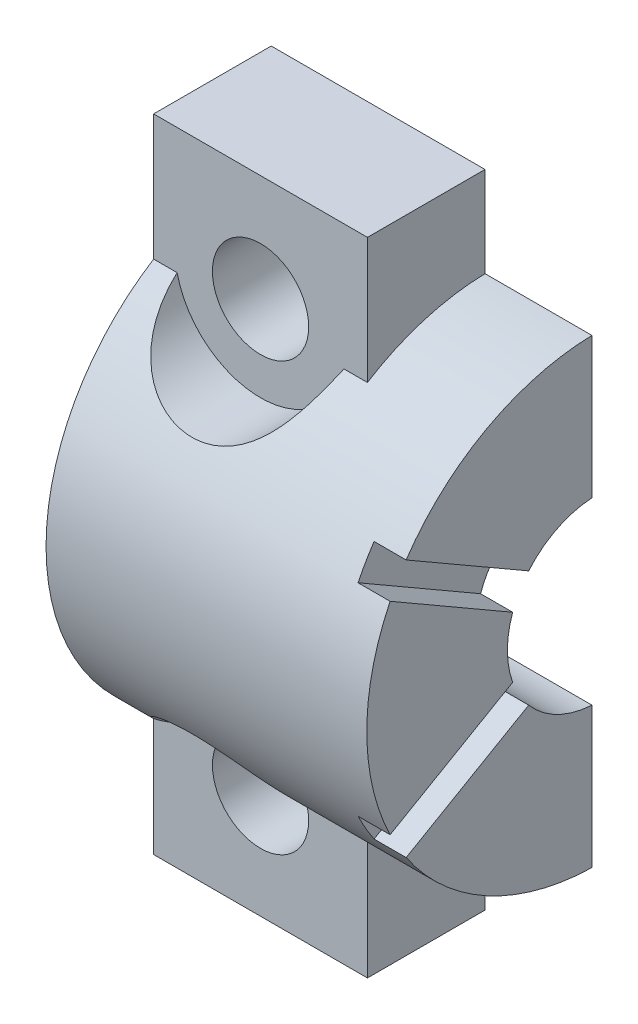
ISO-10303-21;
HEADER;
FILE_DESCRIPTION(('STEP AP214'),'2;1');
FILE_NAME('part.step','',(''),(''),'','','');
FILE_SCHEMA(('AUTOMOTIVE_DESIGN { 1 0 10303 214 1 1 1 1 }'));
ENDSEC;
DATA;
#1=APPLICATION_CONTEXT('core data for automotive mechanical design processes');
#2=APPLICATION_PROTOCOL_DEFINITION('international standard','automotive_design',2000,#1);
#3=PRODUCT_CONTEXT('',#1,'mechanical');
#4=PRODUCT('Part','Part','',(#3));
#5=PRODUCT_RELATED_PRODUCT_CATEGORY('part','',(#4));
#6=PRODUCT_DEFINITION_FORMATION('','',#4);
#7=PRODUCT_DEFINITION_CONTEXT('part definition',#1,'design');
#8=PRODUCT_DEFINITION('design','',#6,#7);
#9=PRODUCT_DEFINITION_SHAPE('','',#8);
#10=(LENGTH_UNIT() NAMED_UNIT(*) SI_UNIT(.MILLI.,.METRE.));
#11=(NAMED_UNIT(*) PLANE_ANGLE_UNIT() SI_UNIT($,.RADIAN.));
#12=(NAMED_UNIT(*) SI_UNIT($,.STERADIAN.) SOLID_ANGLE_UNIT());
#13=UNCERTAINTY_MEASURE_WITH_UNIT(LENGTH_MEASURE(1.E-05),#10,'distance_accuracy_value','');
#14=(GEOMETRIC_REPRESENTATION_CONTEXT(3) GLOBAL_UNCERTAINTY_ASSIGNED_CONTEXT((#13)) GLOBAL_UNIT_ASSIGNED_CONTEXT((#10,
#11,#12)) REPRESENTATION_CONTEXT('',''));
#15=CARTESIAN_POINT('',(0.,0.,0.));
#16=DIRECTION('',(0.,0.,1.));
#17=DIRECTION('',(1.,0.,0.));
#18=AXIS2_PLACEMENT_3D('',#15,#16,#17);
#19=CARTESIAN_POINT('',(0.,0.,0.));
#20=DIRECTION('',(0.,0.,-1.));
#21=DIRECTION('',(-1.,0.,0.));
#22=AXIS2_PLACEMENT_3D('',#19,#20,#21);
#23=PLANE('',#22);
#24=DIRECTION('',(1.,0.,0.));
#25=VECTOR('',#24,1.);
#26=CARTESIAN_POINT('',(-5.,-15.,0.));
#27=LINE('',#26,#25);
#28=CARTESIAN_POINT('',(-5.,-15.,0.));
#29=VERTEX_POINT('',#28);
#30=CARTESIAN_POINT('',(5.,-15.,0.));
#31=VERTEX_POINT('',#30);
#32=EDGE_CURVE('E233',#29,#31,#27,.T.);
#33=ORIENTED_EDGE('',*,*,#32,.F.);
#34=DIRECTION('',(0.,-1.,0.));
#35=VECTOR('',#34,1.);
#36=CARTESIAN_POINT('',(-5.,-15.,0.));
#37=LINE('',#36,#35);
#38=CARTESIAN_POINT('',(-5.,-4.19756179227894,0.));
#39=VERTEX_POINT('',#38);
#40=EDGE_CURVE('E230',#39,#29,#37,.T.);
#41=ORIENTED_EDGE('',*,*,#40,.F.);
#42=DIRECTION('',(1.,0.,0.));
#43=VECTOR('',#42,1.);
#44=CARTESIAN_POINT('',(-5.,-4.19756179227894,0.));
#45=LINE('',#44,#43);
#46=CARTESIAN_POINT('',(10.,-4.19756179227894,0.));
#47=VERTEX_POINT('',#46);
#48=EDGE_CURVE('E246',#47,#39,#45,.F.);
#49=ORIENTED_EDGE('',*,*,#48,.F.);
#50=DIRECTION('',(0.,1.,0.));
#51=VECTOR('',#50,1.);
#52=CARTESIAN_POINT('',(10.,0.,0.));
#53=LINE('',#52,#51);
#54=CARTESIAN_POINT('',(10.,-10.778360831734,0.));
#55=VERTEX_POINT('',#54);
#56=EDGE_CURVE('E438',#55,#47,#53,.T.);
#57=ORIENTED_EDGE('',*,*,#56,.F.);
#58=DIRECTION('',(1.,0.,0.));
#59=VECTOR('',#58,1.);
#60=CARTESIAN_POINT('',(-28.9916585756488,-10.778360831734,0.));
#61=LINE('',#60,#59);
#62=CARTESIAN_POINT('',(5.,-10.778360831734,0.));
#63=VERTEX_POINT('',#62);
#64=EDGE_CURVE('E362',#63,#55,#61,.T.);
#65=ORIENTED_EDGE('',*,*,#64,.F.);
#66=DIRECTION('',(0.,1.,0.));
#67=VECTOR('',#66,1.);
#68=CARTESIAN_POINT('',(5.,-15.,0.));
#69=LINE('',#68,#67);
#70=EDGE_CURVE('E226',#31,#63,#69,.T.);
#71=ORIENTED_EDGE('',*,*,#70,.F.);
#72=EDGE_LOOP('',(#33,#41,#49,#57,#65,#71));
#73=FACE_BOUND('',#72,.T.);
#74=CARTESIAN_POINT('',(0.,-10.,0.));
#75=DIRECTION('',(0.,0.,1.));
#76=DIRECTION('',(1.,0.,0.));
#77=AXIS2_PLACEMENT_3D('',#74,#75,#76);
#78=CIRCLE('',#77,2.25);
#79=CARTESIAN_POINT('',(2.25,-10.,0.));
#80=VERTEX_POINT('',#79);
#81=EDGE_CURVE('E398',#80,#80,#78,.T.);
#82=ORIENTED_EDGE('',*,*,#81,.T.);
#83=EDGE_LOOP('',(#82));
#84=FACE_BOUND('',#83,.T.);
#85=ADVANCED_FACE('F41',(#73,#84),#23,.T.);
#86=CARTESIAN_POINT('',(-5.,0.,-0.25));
#87=DIRECTION('',(1.,0.,0.));
#88=DIRECTION('',(0.,0.,-1.));
#89=AXIS2_PLACEMENT_3D('',#86,#87,#88);
#90=CYLINDRICAL_SURFACE('',#89,4.205);
#91=DIRECTION('',(1.,0.,0.));
#92=VECTOR('',#91,1.);
#93=CARTESIAN_POINT('',(-5.,2.71830643920744,2.95824486324897));
#94=LINE('',#93,#92);
#95=CARTESIAN_POINT('',(8.5,2.71830643920744,2.95824486324897));
#96=VERTEX_POINT('',#95);
#97=CARTESIAN_POINT('',(10.,2.71830643920744,2.95824486324897));
#98=VERTEX_POINT('',#97);
#99=EDGE_CURVE('E412',#96,#98,#94,.T.);
#100=ORIENTED_EDGE('',*,*,#99,.F.);
#101=CARTESIAN_POINT('',(8.5,0.,-0.25));
#102=DIRECTION('',(-1.,0.,0.));
#103=DIRECTION('',(0.,0.,1.));
#104=AXIS2_PLACEMENT_3D('',#101,#102,#103);
#105=CIRCLE('',#104,4.205);
#106=CARTESIAN_POINT('',(8.5,1.41926833353077,3.70824486324896));
#107=VERTEX_POINT('',#106);
#108=EDGE_CURVE('E414',#96,#107,#105,.F.);
#109=ORIENTED_EDGE('',*,*,#108,.T.);
#110=DIRECTION('',(1.,0.,0.));
#111=VECTOR('',#110,1.);
#112=CARTESIAN_POINT('',(-5.,1.41926833353077,3.70824486324896));
#113=LINE('',#112,#111);
#114=CARTESIAN_POINT('',(10.,1.41926833353077,3.70824486324896));
#115=VERTEX_POINT('',#114);
#116=EDGE_CURVE('E407',#107,#115,#113,.T.);
#117=ORIENTED_EDGE('',*,*,#116,.T.);
#118=CARTESIAN_POINT('',(10.,0.,-0.25));
#119=DIRECTION('',(1.,0.,0.));
#120=DIRECTION('',(0.,0.,-1.));
#121=AXIS2_PLACEMENT_3D('',#118,#119,#120);
#122=CIRCLE('',#121,4.205);
#123=CARTESIAN_POINT('',(10.,-1.4192683335308,3.70824486324895));
#124=VERTEX_POINT('',#123);
#125=EDGE_CURVE('E369',#124,#115,#122,.F.);
#126=ORIENTED_EDGE('',*,*,#125,.F.);
#127=DIRECTION('',(1.,0.,0.));
#128=VECTOR('',#127,1.);
#129=CARTESIAN_POINT('',(-5.,-1.4192683335308,3.70824486324895));
#130=LINE('',#129,#128);
#131=CARTESIAN_POINT('',(8.5,-1.4192683335308,3.70824486324895));
#132=VERTEX_POINT('',#131);
#133=EDGE_CURVE('E429',#132,#124,#130,.T.);
#134=ORIENTED_EDGE('',*,*,#133,.F.);
#135=CARTESIAN_POINT('',(8.5,0.,-0.25));
#136=DIRECTION('',(-1.,0.,0.));
#137=DIRECTION('',(0.,0.,1.));
#138=AXIS2_PLACEMENT_3D('',#135,#136,#137);
#139=CIRCLE('',#138,4.205);
#140=CARTESIAN_POINT('',(8.5,-2.71830643920746,2.95824486324895));
#141=VERTEX_POINT('',#140);
#142=EDGE_CURVE('E431',#132,#141,#139,.F.);
#143=ORIENTED_EDGE('',*,*,#142,.T.);
#144=DIRECTION('',(1.,0.,0.));
#145=VECTOR('',#144,1.);
#146=CARTESIAN_POINT('',(-5.,-2.71830643920746,2.95824486324895));
#147=LINE('',#146,#145);
#148=CARTESIAN_POINT('',(10.,-2.71830643920746,2.95824486324895));
#149=VERTEX_POINT('',#148);
#150=EDGE_CURVE('E423',#141,#149,#147,.T.);
#151=ORIENTED_EDGE('',*,*,#150,.T.);
#152=EDGE_CURVE('E363',#47,#149,#122,.F.);
#153=ORIENTED_EDGE('',*,*,#152,.F.);
#154=ORIENTED_EDGE('',*,*,#48,.T.);
#155=CARTESIAN_POINT('',(-5.,0.,-0.25));
#156=DIRECTION('',(1.,0.,0.));
#157=DIRECTION('',(0.,0.,-1.));
#158=AXIS2_PLACEMENT_3D('',#155,#156,#157);
#159=CIRCLE('',#158,4.205);
#160=CARTESIAN_POINT('',(-5.,4.19756179227894,0.));
#161=VERTEX_POINT('',#160);
#162=EDGE_CURVE('E207',#161,#39,#159,.T.);
#163=ORIENTED_EDGE('',*,*,#162,.F.);
#164=DIRECTION('',(1.,0.,0.));
#165=VECTOR('',#164,1.);
#166=CARTESIAN_POINT('',(-5.,4.19756179227894,0.));
#167=LINE('',#166,#165);
#168=CARTESIAN_POINT('',(10.,4.19756179227894,0.));
#169=VERTEX_POINT('',#168);
#170=EDGE_CURVE('E248',#161,#169,#167,.T.);
#171=ORIENTED_EDGE('',*,*,#170,.T.);
#172=EDGE_CURVE('E371',#98,#169,#122,.F.);
#173=ORIENTED_EDGE('',*,*,#172,.F.);
#174=EDGE_LOOP('',(#100,#109,#117,#126,#134,#143,#151,#153,#154,#163,#171,#173));
#175=FACE_BOUND('',#174,.T.);
#176=ADVANCED_FACE('F326',(#175),#90,.F.);
#177=CARTESIAN_POINT('',(-28.9916585756488,0.,-0.25));
#178=DIRECTION('',(1.,0.,0.));
#179=DIRECTION('',(0.,0.,-1.));
#180=AXIS2_PLACEMENT_3D('',#177,#178,#179);
#181=CYLINDRICAL_SURFACE('',#180,10.7812597695751);
#182=CARTESIAN_POINT('',(-3.90198294588478,9.11992665645167,5.5));
#183=CARTESIAN_POINT('',(-3.88915478812282,9.06307341331074,5.59017449314433));
#184=CARTESIAN_POINT('',(-3.87475338101255,9.00498945363241,5.67933204857714));
#185=CARTESIAN_POINT('',(-3.84238518660202,8.88651052586628,5.85547070704793));
#186=CARTESIAN_POINT('',(-3.82441741977101,8.82611492655388,5.94245120473117));
#187=CARTESIAN_POINT('',(-3.76425168775188,8.64082303685709,6.2011117562662));
#188=CARTESIAN_POINT('',(-3.71596882233741,8.51266967606388,6.36916807038626));
#189=CARTESIAN_POINT('',(-3.62123618638365,8.29856779966826,6.63380695928576));
#190=CARTESIAN_POINT('',(-3.58062863477395,8.21440916016524,6.73396684135775));
#191=CARTESIAN_POINT('',(-3.49076928787825,8.0445573697885,6.9289515116471));
#192=CARTESIAN_POINT('',(-3.44152050299503,7.95886476261855,7.02377814270094));
#193=CARTESIAN_POINT('',(-3.33375129476198,7.78723207145548,7.2072328018618));
#194=CARTESIAN_POINT('',(-3.27525605993475,7.70129326520109,7.29587675326883));
#195=CARTESIAN_POINT('',(-3.14827958580289,7.5302489322511,7.46657295738462));
#196=CARTESIAN_POINT('',(-3.07980106099345,7.44514318573468,7.54862699254122));
#197=CARTESIAN_POINT('',(-2.94732453469085,7.29422344009132,7.68966549725386));
#198=CARTESIAN_POINT('',(-2.88520966387097,7.22798125932153,7.74996449196039));
#199=CARTESIAN_POINT('',(-2.75428717301305,7.09786017493243,7.86563404113933));
#200=CARTESIAN_POINT('',(-2.68548093694552,7.03398078637525,7.92100561022989));
#201=CARTESIAN_POINT('',(-2.54118288423732,6.90945374280165,8.02657422427533));
#202=CARTESIAN_POINT('',(-2.46568717733347,6.84880800158501,8.07676822100602));
#203=CARTESIAN_POINT('',(-2.30829407235652,6.73176032329351,8.17167686656561));
#204=CARTESIAN_POINT('',(-2.22639976777282,6.67535636104273,8.21639413667122));
#205=CARTESIAN_POINT('',(-2.05602027394492,6.5673602378349,8.30044182578099));
#206=CARTESIAN_POINT('',(-1.96749717562868,6.51580026975539,8.3397369209054));
#207=CARTESIAN_POINT('',(-1.7848955994218,6.41882299116927,8.41244467959653));
#208=CARTESIAN_POINT('',(-1.69081961748062,6.37340295059934,8.44585995957708));
#209=CARTESIAN_POINT('',(-1.49776790245325,6.28950568921399,8.50673278923468));
#210=CARTESIAN_POINT('',(-1.39879225546479,6.25102834645548,8.53419044355451));
#211=CARTESIAN_POINT('',(-1.19676098928304,6.18173283384868,8.58309363519935));
#212=CARTESIAN_POINT('',(-1.0937057903473,6.15091387743508,8.60453978997284));
#213=CARTESIAN_POINT('',(-0.895201804258613,6.10025595472564,8.63950422683373));
#214=CARTESIAN_POINT('',(-0.800060368921739,6.07961386001304,8.65361091170681));
#215=CARTESIAN_POINT('',(-0.607910469051083,6.04525959374726,8.67697215810425));
#216=CARTESIAN_POINT('',(-0.510901400363722,6.03154970513957,8.68622512121649));
#217=CARTESIAN_POINT('',(-0.315865168058899,6.01128641288921,8.69986856004321));
#218=CARTESIAN_POINT('',(-0.217838716243804,6.00472830687283,8.70426223082145));
#219=CARTESIAN_POINT('',(-0.0214344487847485,5.99885072164389,8.70820101088172));
#220=CARTESIAN_POINT('',(0.0769434813456644,5.99953386725275,8.70774436201137));
#221=CARTESIAN_POINT('',(0.268777701823314,6.00793858304255,8.70210919510973));
#222=CARTESIAN_POINT('',(0.362254626419306,6.01533913777062,8.69714603336443));
#223=CARTESIAN_POINT('',(0.548156712133022,6.03663272970387,8.68279308799052));
#224=CARTESIAN_POINT('',(0.640581492109701,6.05052804750373,8.67340174942562));
#225=CARTESIAN_POINT('',(0.823646988288896,6.08461118070082,8.65019622599559));
#226=CARTESIAN_POINT('',(0.914288614662407,6.10479569240018,8.63638436311759));
#227=CARTESIAN_POINT('',(1.09325079362337,6.15118819666196,8.60433455659975));
#228=CARTESIAN_POINT('',(1.1815704737516,6.17739841830172,8.58609497488387));
#229=CARTESIAN_POINT('',(1.35558993471274,6.23558522896432,8.54512976564765));
#230=CARTESIAN_POINT('',(1.44127926240171,6.26758202605459,8.5223883896145));
#231=CARTESIAN_POINT('',(1.60918932266124,6.33683541249837,8.47249400247579));
#232=CARTESIAN_POINT('',(1.69140879495847,6.37409389193305,8.44533940553908));
#233=CARTESIAN_POINT('',(1.93208490068475,6.49301062140546,8.35732772644335));
#234=CARTESIAN_POINT('',(2.08470894720048,6.58186126057911,8.28988779867628));
#235=CARTESIAN_POINT('',(2.37839232290267,6.7788007973665,8.13450262504058));
#236=CARTESIAN_POINT('',(2.51849128606859,6.88762970122812,8.04570042074368));
#237=CARTESIAN_POINT('',(2.77664459835844,7.11557649122033,7.85102075401282));
#238=CARTESIAN_POINT('',(2.89469725485466,7.2346951663326,7.74514198166998));
#239=CARTESIAN_POINT('',(3.07600213966994,7.44053429163797,7.55303601860933));
#240=CARTESIAN_POINT('',(3.14496192380018,7.52599765984082,7.47072861187534));
#241=CARTESIAN_POINT('',(3.27282969243874,7.69781654310284,7.29942953990437));
#242=CARTESIAN_POINT('',(3.33173404584337,7.78417236854815,7.21043547669369));
#243=CARTESIAN_POINT('',(3.44023534488381,7.95666918097199,7.02619087907062));
#244=CARTESIAN_POINT('',(3.48980378200092,8.0428087419693,6.93092234293173));
#245=CARTESIAN_POINT('',(3.58021157641135,8.21354559702769,6.73499423523558));
#246=CARTESIAN_POINT('',(3.62104782597902,8.29814233224245,6.63433276025405));
#247=CARTESIAN_POINT('',(3.71597813533576,8.51269034773149,6.36914266812123));
#248=CARTESIAN_POINT('',(3.76426663279042,8.64086258427933,6.2010599135221));
#249=CARTESIAN_POINT('',(3.8244316498195,8.82616196693406,5.94238386165377));
#250=CARTESIAN_POINT('',(3.84239580416912,8.88654775881997,5.85541622031855));
#251=CARTESIAN_POINT('',(3.87475790106451,9.00500762534525,5.6793041677308));
#252=CARTESIAN_POINT('',(3.88915683035567,9.06308233587832,5.59016036629359));
#253=CARTESIAN_POINT('',(3.90198294588478,9.11992665645167,5.5));
#254=B_SPLINE_CURVE_WITH_KNOTS('',3,(#182,#183,#184,#185,#186,#187,#188,#189,#190,#191,#192,
#193,#194,#195,#196,#197,#198,#199,#200,#201,#202,#203,#204,#205,#206,#207,#208,#209,#210,#211,
#212,#213,#214,#215,#216,#217,#218,#219,#220,#221,#222,#223,#224,#225,#226,#227,#228,#229,#230,
#231,#232,#233,#234,#235,#236,#237,#238,#239,#240,#241,#242,#243,#244,#245,#246,#247,#248,#249,
#250,#251,#252,#253),.UNSPECIFIED.,.F.,.F.,(4,2,2,2,2,2,2,2,2,2,2,2,2,2,2,2,2,2,2,2,2,2,2,2,2,2,
2,2,2,2,2,2,2,2,2,4),(0.,0.322050069679456,0.644188715829641,1.29324304907911,1.70386677735999,
2.11434773697905,2.52372917554993,2.93299950861411,3.25970325439259,3.58633957139136,
3.91316710642086,4.23983759848184,4.56854479693666,4.89710535455478,5.22566014070001,
5.55418116820488,5.84892491101082,6.14376565704302,6.4384124250211,6.7331660007204,
7.01453515278113,7.29600318013861,7.57732360160232,7.85874825923106,8.14117539274917,
8.4237042379356,8.98828156874892,9.58109976110972,10.1739634489976,10.5851602317276,
10.996505188531,11.4090865711744,11.8218145452148,12.470968726146,12.7930577330697,
13.1150574956994),.UNSPECIFIED.);
#255=CARTESIAN_POINT('',(-3.90198294588478,9.11992665645166,5.5));
#256=VERTEX_POINT('',#255);
#257=CARTESIAN_POINT('',(3.90198294588478,9.11992665645166,5.5));
#258=VERTEX_POINT('',#257);
#259=EDGE_CURVE('E11',#256,#258,#254,.T.);
#260=ORIENTED_EDGE('',*,*,#259,.F.);
#261=DIRECTION('',(1.,0.,0.));
#262=VECTOR('',#261,1.);
#263=CARTESIAN_POINT('',(-28.9916585756488,9.11992665645166,5.5));
#264=LINE('',#263,#262);
#265=CARTESIAN_POINT('',(-5.,9.11992665645166,5.5));
#266=VERTEX_POINT('',#265);
#267=EDGE_CURVE('E189',#266,#256,#264,.T.);
#268=ORIENTED_EDGE('',*,*,#267,.F.);
#269=CARTESIAN_POINT('',(-5.,0.,-0.25));
#270=DIRECTION('',(1.,0.,0.));
#271=DIRECTION('',(0.,0.,-1.));
#272=AXIS2_PLACEMENT_3D('',#269,#270,#271);
#273=CIRCLE('',#272,10.7812597695751);
#274=CARTESIAN_POINT('',(-5.,-9.11992665645166,5.5));
#275=VERTEX_POINT('',#274);
#276=EDGE_CURVE('E366',#275,#266,#273,.F.);
#277=ORIENTED_EDGE('',*,*,#276,.F.);
#278=DIRECTION('',(1.,0.,0.));
#279=VECTOR('',#278,1.);
#280=CARTESIAN_POINT('',(-28.9916585756488,-9.11992665645166,5.5));
#281=LINE('',#280,#279);
#282=CARTESIAN_POINT('',(-3.90198294588478,-9.11992665645166,5.5));
#283=VERTEX_POINT('',#282);
#284=EDGE_CURVE('E373',#283,#275,#281,.F.);
#285=ORIENTED_EDGE('',*,*,#284,.F.);
#286=CARTESIAN_POINT('',(3.90198294588478,-9.11992665645167,5.5));
#287=CARTESIAN_POINT('',(3.88915478812282,-9.06307341331074,5.59017449314433));
#288=CARTESIAN_POINT('',(3.87475338101255,-9.00498945363241,5.67933204857714));
#289=CARTESIAN_POINT('',(3.84238518660202,-8.88651052586628,5.85547070704793));
#290=CARTESIAN_POINT('',(3.82441741977101,-8.82611492655388,5.94245120473117));
#291=CARTESIAN_POINT('',(3.76425168775187,-8.64082303685709,6.2011117562662));
#292=CARTESIAN_POINT('',(3.71596882233741,-8.51266967606388,6.36916807038626));
#293=CARTESIAN_POINT('',(3.62123618638364,-8.29856779966826,6.63380695928576));
#294=CARTESIAN_POINT('',(3.58062863477395,-8.21440916016524,6.73396684135775));
#295=CARTESIAN_POINT('',(3.49076928787825,-8.0445573697885,6.9289515116471));
#296=CARTESIAN_POINT('',(3.44152050299503,-7.95886476261855,7.02377814270094));
#297=CARTESIAN_POINT('',(3.33375129476198,-7.78723207145548,7.2072328018618));
#298=CARTESIAN_POINT('',(3.27525605993474,-7.70129326520109,7.29587675326883));
#299=CARTESIAN_POINT('',(3.14827958580288,-7.5302489322511,7.46657295738461));
#300=CARTESIAN_POINT('',(3.07980106099345,-7.44514318573468,7.54862699254122));
#301=CARTESIAN_POINT('',(2.94732453469085,-7.29422344009132,7.68966549725386));
#302=CARTESIAN_POINT('',(2.88520966387097,-7.22798125932153,7.74996449196039));
#303=CARTESIAN_POINT('',(2.75428717301305,-7.09786017493244,7.86563404113933));
#304=CARTESIAN_POINT('',(2.68548093694552,-7.03398078637526,7.92100561022989));
#305=CARTESIAN_POINT('',(2.54118288423732,-6.90945374280165,8.02657422427533));
#306=CARTESIAN_POINT('',(2.46568717733346,-6.84880800158501,8.07676822100602));
#307=CARTESIAN_POINT('',(2.30829407235652,-6.73176032329352,8.17167686656561));
#308=CARTESIAN_POINT('',(2.22639976777282,-6.67535636104274,8.21639413667122));
#309=CARTESIAN_POINT('',(2.05602027394492,-6.56736023783491,8.30044182578098));
#310=CARTESIAN_POINT('',(1.96749717562868,-6.51580026975539,8.33973692090539));
#311=CARTESIAN_POINT('',(1.7848955994218,-6.41882299116928,8.41244467959653));
#312=CARTESIAN_POINT('',(1.69081961748062,-6.37340295059934,8.44585995957708));
#313=CARTESIAN_POINT('',(1.49776790245325,-6.28950568921399,8.50673278923467));
#314=CARTESIAN_POINT('',(1.39879225546479,-6.25102834645548,8.53419044355451));
#315=CARTESIAN_POINT('',(1.19676098928304,-6.18173283384868,8.58309363519935));
#316=CARTESIAN_POINT('',(1.09370579034729,-6.15091387743508,8.60453978997284));
#317=CARTESIAN_POINT('',(0.895201804258613,-6.10025595472564,8.63950422683373));
#318=CARTESIAN_POINT('',(0.800060368921738,-6.07961386001304,8.6536109117068));
#319=CARTESIAN_POINT('',(0.607910469051082,-6.04525959374726,8.67697215810425));
#320=CARTESIAN_POINT('',(0.510901400363721,-6.03154970513957,8.68622512121649));
#321=CARTESIAN_POINT('',(0.315865168058898,-6.01128641288922,8.69986856004321));
#322=CARTESIAN_POINT('',(0.217838716243803,-6.00472830687283,8.70426223082145));
#323=CARTESIAN_POINT('',(0.021434448784748,-5.9988507216439,8.70820101088172));
#324=CARTESIAN_POINT('',(-0.0769434813456644,-5.99953386725275,8.70774436201137));
#325=CARTESIAN_POINT('',(-0.268777701823313,-6.00793858304256,8.70210919510973));
#326=CARTESIAN_POINT('',(-0.362254626419305,-6.01533913777063,8.69714603336443));
#327=CARTESIAN_POINT('',(-0.548156712133021,-6.03663272970387,8.68279308799051));
#328=CARTESIAN_POINT('',(-0.640581492109701,-6.05052804750374,8.67340174942562));
#329=CARTESIAN_POINT('',(-0.823646988288895,-6.08461118070083,8.65019622599559));
#330=CARTESIAN_POINT('',(-0.914288614662406,-6.10479569240018,8.63638436311759));
#331=CARTESIAN_POINT('',(-1.09325079362337,-6.15118819666196,8.60433455659975));
#332=CARTESIAN_POINT('',(-1.1815704737516,-6.17739841830172,8.58609497488387));
#333=CARTESIAN_POINT('',(-1.35558993471274,-6.23558522896432,8.54512976564765));
#334=CARTESIAN_POINT('',(-1.4412792624017,-6.2675820260546,8.52238838961449));
#335=CARTESIAN_POINT('',(-1.60918932266123,-6.33683541249837,8.47249400247579));
#336=CARTESIAN_POINT('',(-1.69140879495847,-6.37409389193305,8.44533940553907));
#337=CARTESIAN_POINT('',(-1.93208490068475,-6.49301062140546,8.35732772644335));
#338=CARTESIAN_POINT('',(-2.08470894720048,-6.58186126057911,8.28988779867628));
#339=CARTESIAN_POINT('',(-2.37839232290267,-6.7788007973665,8.13450262504058));
#340=CARTESIAN_POINT('',(-2.51849128606859,-6.88762970122812,8.04570042074368));
#341=CARTESIAN_POINT('',(-2.77664459835844,-7.11557649122033,7.85102075401282));
#342=CARTESIAN_POINT('',(-2.89469725485466,-7.2346951663326,7.74514198166998));
#343=CARTESIAN_POINT('',(-3.07600213966993,-7.44053429163798,7.55303601860933));
#344=CARTESIAN_POINT('',(-3.14496192380018,-7.52599765984082,7.47072861187534));
#345=CARTESIAN_POINT('',(-3.27282969243874,-7.69781654310284,7.29942953990437));
#346=CARTESIAN_POINT('',(-3.33173404584336,-7.78417236854816,7.21043547669369));
#347=CARTESIAN_POINT('',(-3.44023534488381,-7.95666918097199,7.02619087907061));
#348=CARTESIAN_POINT('',(-3.48980378200091,-8.0428087419693,6.93092234293173));
#349=CARTESIAN_POINT('',(-3.58021157641134,-8.21354559702769,6.73499423523558));
#350=CARTESIAN_POINT('',(-3.62104782597901,-8.29814233224245,6.63433276025404));
#351=CARTESIAN_POINT('',(-3.71597813533576,-8.51269034773149,6.36914266812123));
#352=CARTESIAN_POINT('',(-3.76426663279042,-8.64086258427933,6.2010599135221));
#353=CARTESIAN_POINT('',(-3.8244316498195,-8.82616196693406,5.94238386165377));
#354=CARTESIAN_POINT('',(-3.84239580416912,-8.88654775881997,5.85541622031855));
#355=CARTESIAN_POINT('',(-3.87475790106451,-9.00500762534525,5.6793041677308));
#356=CARTESIAN_POINT('',(-3.88915683035567,-9.06308233587832,5.59016036629359));
#357=CARTESIAN_POINT('',(-3.90198294588478,-9.11992665645167,5.5));
#358=B_SPLINE_CURVE_WITH_KNOTS('',3,(#286,#287,#288,#289,#290,#291,#292,#293,#294,#295,#296,
#297,#298,#299,#300,#301,#302,#303,#304,#305,#306,#307,#308,#309,#310,#311,#312,#313,#314,#315,
#316,#317,#318,#319,#320,#321,#322,#323,#324,#325,#326,#327,#328,#329,#330,#331,#332,#333,#334,
#335,#336,#337,#338,#339,#340,#341,#342,#343,#344,#345,#346,#347,#348,#349,#350,#351,#352,#353,
#354,#355,#356,#357),.UNSPECIFIED.,.F.,.F.,(4,2,2,2,2,2,2,2,2,2,2,2,2,2,2,2,2,2,2,2,2,2,2,2,2,2,
2,2,2,2,2,2,2,2,2,4),(0.,0.322050069679456,0.644188715829641,1.29324304907911,1.70386677735999,
2.11434773697905,2.52372917554993,2.93299950861411,3.25970325439258,3.58633957139136,
3.91316710642086,4.23983759848183,4.56854479693665,4.89710535455477,5.22566014070001,
5.55418116820488,5.84892491101081,6.14376565704301,6.4384124250211,6.7331660007204,
7.01453515278112,7.29600318013861,7.57732360160232,7.85874825923106,8.14117539274916,
8.42370423793559,8.98828156874891,9.58109976110971,10.1739634489976,10.5851602317276,
10.996505188531,11.4090865711744,11.8218145452148,12.470968726146,12.7930577330697,
13.1150574956994),.UNSPECIFIED.);
#359=CARTESIAN_POINT('',(3.90198294588478,-9.11992665645166,5.5));
#360=VERTEX_POINT('',#359);
#361=EDGE_CURVE('E55',#360,#283,#358,.T.);
#362=ORIENTED_EDGE('',*,*,#361,.F.);
#363=CARTESIAN_POINT('',(5.,-9.11992665645166,5.5));
#364=VERTEX_POINT('',#363);
#365=EDGE_CURVE('E374',#364,#360,#281,.F.);
#366=ORIENTED_EDGE('',*,*,#365,.F.);
#367=CARTESIAN_POINT('',(5.,0.,-0.25));
#368=DIRECTION('',(-1.,0.,0.));
#369=DIRECTION('',(0.,0.,1.));
#370=AXIS2_PLACEMENT_3D('',#367,#368,#369);
#371=CIRCLE('',#370,10.7812597695751);
#372=EDGE_CURVE('E209',#63,#364,#371,.T.);
#373=ORIENTED_EDGE('',*,*,#372,.F.);
#374=ORIENTED_EDGE('',*,*,#64,.T.);
#375=CARTESIAN_POINT('',(10.,0.,-0.25));
#376=DIRECTION('',(1.,0.,0.));
#377=DIRECTION('',(0.,0.,-1.));
#378=AXIS2_PLACEMENT_3D('',#375,#376,#377);
#379=CIRCLE('',#378,10.7812597695751);
#380=CARTESIAN_POINT('',(10.,-6.02708965253895,8.68922549997009));
#381=VERTEX_POINT('',#380);
#382=EDGE_CURVE('E436',#381,#55,#379,.T.);
#383=ORIENTED_EDGE('',*,*,#382,.F.);
#384=DIRECTION('',(1.,0.,0.));
#385=VECTOR('',#384,1.);
#386=CARTESIAN_POINT('',(-28.9916585756488,-6.02708965253895,8.68922549997009));
#387=LINE('',#386,#385);
#388=CARTESIAN_POINT('',(8.5,-6.02708965253896,8.68922549997009));
#389=VERTEX_POINT('',#388);
#390=EDGE_CURVE('E70',#389,#381,#387,.T.);
#391=ORIENTED_EDGE('',*,*,#390,.F.);
#392=CARTESIAN_POINT('',(8.5,0.,-0.25));
#393=DIRECTION('',(-1.,0.,0.));
#394=DIRECTION('',(0.,0.,1.));
#395=AXIS2_PLACEMENT_3D('',#392,#393,#394);
#396=CIRCLE('',#395,10.7812597695751);
#397=CARTESIAN_POINT('',(8.5,-4.7280515468623,9.43922549997009));
#398=VERTEX_POINT('',#397);
#399=EDGE_CURVE('E256',#398,#389,#396,.F.);
#400=ORIENTED_EDGE('',*,*,#399,.F.);
#401=DIRECTION('',(1.,0.,0.));
#402=VECTOR('',#401,1.);
#403=CARTESIAN_POINT('',(-28.9916585756488,-4.7280515468623,9.43922549997009));
#404=LINE('',#403,#402);
#405=CARTESIAN_POINT('',(10.,-4.7280515468623,9.43922549997009));
#406=VERTEX_POINT('',#405);
#407=EDGE_CURVE('E426',#398,#406,#404,.T.);
#408=ORIENTED_EDGE('',*,*,#407,.T.);
#409=CARTESIAN_POINT('',(10.,4.72805154686223,9.43922549997013));
#410=VERTEX_POINT('',#409);
#411=EDGE_CURVE('E439',#410,#406,#379,.T.);
#412=ORIENTED_EDGE('',*,*,#411,.F.);
#413=DIRECTION('',(1.,0.,0.));
#414=VECTOR('',#413,1.);
#415=CARTESIAN_POINT('',(-28.9916585756488,4.72805154686223,9.43922549997013));
#416=LINE('',#415,#414);
#417=CARTESIAN_POINT('',(8.5,4.72805154686223,9.43922549997013));
#418=VERTEX_POINT('',#417);
#419=EDGE_CURVE('E62',#418,#410,#416,.T.);
#420=ORIENTED_EDGE('',*,*,#419,.F.);
#421=CARTESIAN_POINT('',(8.5,0.,-0.25));
#422=DIRECTION('',(-1.,0.,0.));
#423=DIRECTION('',(0.,0.,1.));
#424=AXIS2_PLACEMENT_3D('',#421,#422,#423);
#425=CIRCLE('',#424,10.7812597695751);
#426=CARTESIAN_POINT('',(8.5,6.02708965253889,8.68922549997014));
#427=VERTEX_POINT('',#426);
#428=EDGE_CURVE('E263',#427,#418,#425,.F.);
#429=ORIENTED_EDGE('',*,*,#428,.F.);
#430=DIRECTION('',(1.,0.,0.));
#431=VECTOR('',#430,1.);
#432=CARTESIAN_POINT('',(-28.9916585756488,6.02708965253889,8.68922549997014));
#433=LINE('',#432,#431);
#434=CARTESIAN_POINT('',(10.,6.02708965253889,8.68922549997014));
#435=VERTEX_POINT('',#434);
#436=EDGE_CURVE('E410',#427,#435,#433,.T.);
#437=ORIENTED_EDGE('',*,*,#436,.T.);
#438=CARTESIAN_POINT('',(10.,10.778360831734,0.));
#439=VERTEX_POINT('',#438);
#440=EDGE_CURVE('E360',#439,#435,#379,.T.);
#441=ORIENTED_EDGE('',*,*,#440,.F.);
#442=DIRECTION('',(1.,0.,0.));
#443=VECTOR('',#442,1.);
#444=CARTESIAN_POINT('',(-28.9916585756488,10.778360831734,0.));
#445=LINE('',#444,#443);
#446=CARTESIAN_POINT('',(5.,10.778360831734,0.));
#447=VERTEX_POINT('',#446);
#448=EDGE_CURVE('E353',#447,#439,#445,.T.);
#449=ORIENTED_EDGE('',*,*,#448,.F.);
#450=CARTESIAN_POINT('',(5.,9.11992665645166,5.5));
#451=VERTEX_POINT('',#450);
#452=EDGE_CURVE('E205',#451,#447,#371,.T.);
#453=ORIENTED_EDGE('',*,*,#452,.F.);
#454=EDGE_CURVE('E192',#258,#451,#264,.T.);
#455=ORIENTED_EDGE('',*,*,#454,.F.);
#456=EDGE_LOOP('',(#260,#268,#277,#285,#362,#366,#373,#374,#383,#391,#400,#408,#412,#420,#429,
#437,#441,#449,#453,#455));
#457=FACE_BOUND('',#456,.T.);
#458=ADVANCED_FACE('F186',(#457),#181,.T.);
#459=CARTESIAN_POINT('',(10.,0.,0.));
#460=DIRECTION('',(1.,0.,0.));
#461=DIRECTION('',(0.,0.,-1.));
#462=AXIS2_PLACEMENT_3D('',#459,#460,#461);
#463=PLANE('',#462);
#464=ORIENTED_EDGE('',*,*,#440,.T.);
#465=DIRECTION('',(0.,-0.499999999999995,-0.866025403784442));
#466=VECTOR('',#465,1.);
#467=CARTESIAN_POINT('',(10.,0.757772228311385,-0.437499999999995));
#468=LINE('',#467,#466);
#469=EDGE_CURVE('E260',#435,#98,#468,.T.);
#470=ORIENTED_EDGE('',*,*,#469,.T.);
#471=ORIENTED_EDGE('',*,*,#172,.T.);
#472=DIRECTION('',(0.,1.,0.));
#473=VECTOR('',#472,1.);
#474=CARTESIAN_POINT('',(10.,0.,0.));
#475=LINE('',#474,#473);
#476=EDGE_CURVE('E434',#169,#439,#475,.T.);
#477=ORIENTED_EDGE('',*,*,#476,.T.);
#478=EDGE_LOOP('',(#464,#470,#471,#477));
#479=FACE_BOUND('',#478,.T.);
#480=ADVANCED_FACE('F311',(#479),#463,.T.);
#481=DIRECTION('',(0.,-0.499999999999995,-0.866025403784442));
#482=VECTOR('',#481,1.);
#483=CARTESIAN_POINT('',(10.,-0.541265877365277,0.312499999999997));
#484=LINE('',#483,#482);
#485=EDGE_CURVE('E258',#410,#115,#484,.T.);
#486=ORIENTED_EDGE('',*,*,#485,.F.);
#487=ORIENTED_EDGE('',*,*,#411,.T.);
#488=DIRECTION('',(0.,0.500000000000001,-0.866025403784438));
#489=VECTOR('',#488,1.);
#490=CARTESIAN_POINT('',(10.,0.541265877365273,0.312500000000001));
#491=LINE('',#490,#489);
#492=EDGE_CURVE('E253',#406,#124,#491,.T.);
#493=ORIENTED_EDGE('',*,*,#492,.T.);
#494=ORIENTED_EDGE('',*,*,#125,.T.);
#495=EDGE_LOOP('',(#486,#487,#493,#494));
#496=FACE_BOUND('',#495,.T.);
#497=ADVANCED_FACE('F312',(#496),#463,.T.);
#498=CARTESIAN_POINT('',(5.,-15.,5.5));
#499=DIRECTION('',(-1.,0.,0.));
#500=DIRECTION('',(0.,0.,1.));
#501=AXIS2_PLACEMENT_3D('',#498,#499,#500);
#502=PLANE('',#501);
#503=DIRECTION('',(0.,1.,0.));
#504=VECTOR('',#503,1.);
#505=CARTESIAN_POINT('',(5.,-15.,5.5));
#506=LINE('',#505,#504);
#507=CARTESIAN_POINT('',(5.,15.,5.5));
#508=VERTEX_POINT('',#507);
#509=EDGE_CURVE('E219',#451,#508,#506,.T.);
#510=ORIENTED_EDGE('',*,*,#509,.F.);
#511=ORIENTED_EDGE('',*,*,#452,.T.);
#512=CARTESIAN_POINT('',(5.,15.,0.));
#513=VERTEX_POINT('',#512);
#514=EDGE_CURVE('E214',#447,#513,#69,.T.);
#515=ORIENTED_EDGE('',*,*,#514,.T.);
#516=DIRECTION('',(0.,0.,-1.));
#517=VECTOR('',#516,1.);
#518=CARTESIAN_POINT('',(5.,15.,5.5));
#519=LINE('',#518,#517);
#520=EDGE_CURVE('E243',#508,#513,#519,.T.);
#521=ORIENTED_EDGE('',*,*,#520,.F.);
#522=EDGE_LOOP('',(#510,#511,#515,#521));
#523=FACE_BOUND('',#522,.T.);
#524=ADVANCED_FACE('F323',(#523),#502,.F.);
#525=CARTESIAN_POINT('',(0.,0.,5.5));
#526=DIRECTION('',(0.,0.,-1.));
#527=DIRECTION('',(-1.,0.,0.));
#528=AXIS2_PLACEMENT_3D('',#525,#526,#527);
#529=PLANE('',#528);
#530=CARTESIAN_POINT('',(0.,10.,5.5));
#531=DIRECTION('',(0.,0.,-1.));
#532=DIRECTION('',(-1.,0.,0.));
#533=AXIS2_PLACEMENT_3D('',#530,#531,#532);
#534=CIRCLE('',#533,4.);
#535=EDGE_CURVE('E195',#256,#258,#534,.F.);
#536=ORIENTED_EDGE('',*,*,#535,.T.);
#537=ORIENTED_EDGE('',*,*,#454,.T.);
#538=ORIENTED_EDGE('',*,*,#509,.T.);
#539=DIRECTION('',(-1.,0.,0.));
#540=VECTOR('',#539,1.);
#541=CARTESIAN_POINT('',(-5.,15.,5.5));
#542=LINE('',#541,#540);
#543=CARTESIAN_POINT('',(-5.,15.,5.5));
#544=VERTEX_POINT('',#543);
#545=EDGE_CURVE('E218',#508,#544,#542,.T.);
#546=ORIENTED_EDGE('',*,*,#545,.T.);
#547=DIRECTION('',(0.,-1.,0.));
#548=VECTOR('',#547,1.);
#549=CARTESIAN_POINT('',(-5.,-15.,5.5));
#550=LINE('',#549,#548);
#551=EDGE_CURVE('E204',#544,#266,#550,.T.);
#552=ORIENTED_EDGE('',*,*,#551,.T.);
#553=ORIENTED_EDGE('',*,*,#267,.T.);
#554=EDGE_LOOP('',(#536,#537,#538,#546,#552,#553));
#555=FACE_BOUND('',#554,.T.);
#556=CARTESIAN_POINT('',(0.,10.,5.5));
#557=DIRECTION('',(0.,0.,-1.));
#558=DIRECTION('',(-1.,0.,0.));
#559=AXIS2_PLACEMENT_3D('',#556,#557,#558);
#560=CIRCLE('',#559,2.25);
#561=CARTESIAN_POINT('',(-2.25,10.,5.5));
#562=VERTEX_POINT('',#561);
#563=EDGE_CURVE('E395',#562,#562,#560,.T.);
#564=ORIENTED_EDGE('',*,*,#563,.T.);
#565=EDGE_LOOP('',(#564));
#566=FACE_BOUND('',#565,.T.);
#567=ADVANCED_FACE('F201',(#555,#566),#529,.F.);
#568=CARTESIAN_POINT('',(0.,10.,0.));
#569=DIRECTION('',(0.,0.,1.));
#570=DIRECTION('',(1.,0.,0.));
#571=AXIS2_PLACEMENT_3D('',#568,#569,#570);
#572=CIRCLE('',#571,2.25);
#573=CARTESIAN_POINT('',(2.25,10.,0.));
#574=VERTEX_POINT('',#573);
#575=EDGE_CURVE('E198',#574,#574,#572,.T.);
#576=ORIENTED_EDGE('',*,*,#575,.T.);
#577=EDGE_LOOP('',(#576));
#578=FACE_BOUND('',#577,.T.);
#579=ORIENTED_EDGE('',*,*,#514,.F.);
#580=ORIENTED_EDGE('',*,*,#448,.T.);
#581=ORIENTED_EDGE('',*,*,#476,.F.);
#582=ORIENTED_EDGE('',*,*,#170,.F.);
#583=CARTESIAN_POINT('',(-5.,15.,0.));
#584=VERTEX_POINT('',#583);
#585=EDGE_CURVE('E231',#584,#161,#37,.T.);
#586=ORIENTED_EDGE('',*,*,#585,.F.);
#587=DIRECTION('',(-1.,0.,0.));
#588=VECTOR('',#587,1.);
#589=CARTESIAN_POINT('',(-5.,15.,0.));
#590=LINE('',#589,#588);
#591=EDGE_CURVE('E228',#513,#584,#590,.T.);
#592=ORIENTED_EDGE('',*,*,#591,.F.);
#593=EDGE_LOOP('',(#579,#580,#581,#582,#586,#592));
#594=FACE_BOUND('',#593,.T.);
#595=ADVANCED_FACE('F329',(#578,#594),#23,.T.);
#596=ORIENTED_EDGE('',*,*,#70,.T.);
#597=ORIENTED_EDGE('',*,*,#372,.T.);
#598=CARTESIAN_POINT('',(5.,-15.,5.5));
#599=VERTEX_POINT('',#598);
#600=EDGE_CURVE('E215',#599,#364,#506,.T.);
#601=ORIENTED_EDGE('',*,*,#600,.F.);
#602=DIRECTION('',(0.,0.,-1.));
#603=VECTOR('',#602,1.);
#604=CARTESIAN_POINT('',(5.,-15.,5.5));
#605=LINE('',#604,#603);
#606=EDGE_CURVE('E225',#599,#31,#605,.T.);
#607=ORIENTED_EDGE('',*,*,#606,.T.);
#608=EDGE_LOOP('',(#596,#597,#601,#607));
#609=FACE_BOUND('',#608,.T.);
#610=ADVANCED_FACE('F43',(#609),#502,.F.);
#611=CARTESIAN_POINT('',(-5.,15.,5.5));
#612=DIRECTION('',(0.,-1.,0.));
#613=DIRECTION('',(0.,0.,-1.));
#614=AXIS2_PLACEMENT_3D('',#611,#612,#613);
#615=PLANE('',#614);
#616=ORIENTED_EDGE('',*,*,#591,.T.);
#617=DIRECTION('',(0.,0.,-1.));
#618=VECTOR('',#617,1.);
#619=CARTESIAN_POINT('',(-5.,15.,5.5));
#620=LINE('',#619,#618);
#621=EDGE_CURVE('E240',#544,#584,#620,.T.);
#622=ORIENTED_EDGE('',*,*,#621,.F.);
#623=ORIENTED_EDGE('',*,*,#545,.F.);
#624=ORIENTED_EDGE('',*,*,#520,.T.);
#625=EDGE_LOOP('',(#616,#622,#623,#624));
#626=FACE_BOUND('',#625,.T.);
#627=ADVANCED_FACE('F343',(#626),#615,.F.);
#628=CARTESIAN_POINT('',(-5.,-15.,5.5));
#629=DIRECTION('',(1.,0.,0.));
#630=DIRECTION('',(0.,0.,-1.));
#631=AXIS2_PLACEMENT_3D('',#628,#629,#630);
#632=PLANE('',#631);
#633=CARTESIAN_POINT('',(-5.,-15.,5.5));
#634=VERTEX_POINT('',#633);
#635=EDGE_CURVE('E221',#275,#634,#550,.T.);
#636=ORIENTED_EDGE('',*,*,#635,.F.);
#637=ORIENTED_EDGE('',*,*,#276,.T.);
#638=ORIENTED_EDGE('',*,*,#551,.F.);
#639=ORIENTED_EDGE('',*,*,#621,.T.);
#640=ORIENTED_EDGE('',*,*,#585,.T.);
#641=ORIENTED_EDGE('',*,*,#162,.T.);
#642=ORIENTED_EDGE('',*,*,#40,.T.);
#643=DIRECTION('',(0.,0.,-1.));
#644=VECTOR('',#643,1.);
#645=CARTESIAN_POINT('',(-5.,-15.,5.5));
#646=LINE('',#645,#644);
#647=EDGE_CURVE('E237',#634,#29,#646,.T.);
#648=ORIENTED_EDGE('',*,*,#647,.F.);
#649=EDGE_LOOP('',(#636,#637,#638,#639,#640,#641,#642,#648));
#650=FACE_BOUND('',#649,.T.);
#651=ADVANCED_FACE('F384',(#650),#632,.F.);
#652=CARTESIAN_POINT('',(-5.,-15.,5.5));
#653=DIRECTION('',(0.,1.,0.));
#654=DIRECTION('',(0.,0.,1.));
#655=AXIS2_PLACEMENT_3D('',#652,#653,#654);
#656=PLANE('',#655);
#657=ORIENTED_EDGE('',*,*,#32,.T.);
#658=ORIENTED_EDGE('',*,*,#606,.F.);
#659=DIRECTION('',(1.,0.,0.));
#660=VECTOR('',#659,1.);
#661=CARTESIAN_POINT('',(-5.,-15.,5.5));
#662=LINE('',#661,#660);
#663=EDGE_CURVE('E223',#634,#599,#662,.T.);
#664=ORIENTED_EDGE('',*,*,#663,.F.);
#665=ORIENTED_EDGE('',*,*,#647,.T.);
#666=EDGE_LOOP('',(#657,#658,#664,#665));
#667=FACE_BOUND('',#666,.T.);
#668=ADVANCED_FACE('F317',(#667),#656,.F.);
#669=CARTESIAN_POINT('',(0.,-10.,5.5));
#670=DIRECTION('',(0.,0.,-1.));
#671=DIRECTION('',(-1.,0.,0.));
#672=AXIS2_PLACEMENT_3D('',#669,#670,#671);
#673=CIRCLE('',#672,4.);
#674=EDGE_CURVE('E199',#360,#283,#673,.F.);
#675=ORIENTED_EDGE('',*,*,#674,.T.);
#676=ORIENTED_EDGE('',*,*,#284,.T.);
#677=ORIENTED_EDGE('',*,*,#635,.T.);
#678=ORIENTED_EDGE('',*,*,#663,.T.);
#679=ORIENTED_EDGE('',*,*,#600,.T.);
#680=ORIENTED_EDGE('',*,*,#365,.T.);
#681=EDGE_LOOP('',(#675,#676,#677,#678,#679,#680));
#682=FACE_BOUND('',#681,.T.);
#683=CARTESIAN_POINT('',(0.,-10.,5.5));
#684=DIRECTION('',(0.,0.,-1.));
#685=DIRECTION('',(-1.,0.,0.));
#686=AXIS2_PLACEMENT_3D('',#683,#684,#685);
#687=CIRCLE('',#686,2.25);
#688=CARTESIAN_POINT('',(-2.25,-10.,5.5));
#689=VERTEX_POINT('',#688);
#690=EDGE_CURVE('E265',#689,#689,#687,.T.);
#691=ORIENTED_EDGE('',*,*,#690,.T.);
#692=EDGE_LOOP('',(#691));
#693=FACE_BOUND('',#692,.T.);
#694=ADVANCED_FACE('F309',(#682,#693),#529,.F.);
#695=DIRECTION('',(0.,0.500000000000001,-0.866025403784438));
#696=VECTOR('',#695,1.);
#697=CARTESIAN_POINT('',(10.,-0.757772228311383,-0.437500000000001));
#698=LINE('',#697,#696);
#699=EDGE_CURVE('E251',#381,#149,#698,.T.);
#700=ORIENTED_EDGE('',*,*,#699,.F.);
#701=ORIENTED_EDGE('',*,*,#382,.T.);
#702=ORIENTED_EDGE('',*,*,#56,.T.);
#703=ORIENTED_EDGE('',*,*,#152,.T.);
#704=EDGE_LOOP('',(#700,#701,#702,#703));
#705=FACE_BOUND('',#704,.T.);
#706=ADVANCED_FACE('F302',(#705),#463,.T.);
#707=CARTESIAN_POINT('',(8.5,0.,0.));
#708=DIRECTION('',(-1.,0.,0.));
#709=DIRECTION('',(0.,0.,1.));
#710=AXIS2_PLACEMENT_3D('',#707,#708,#709);
#711=PLANE('',#710);
#712=DIRECTION('',(0.,-0.500000000000001,0.866025403784438));
#713=VECTOR('',#712,1.);
#714=CARTESIAN_POINT('',(8.5,0.649519052838328,0.125000000000001));
#715=LINE('',#714,#713);
#716=EDGE_CURVE('E417',#132,#398,#715,.T.);
#717=ORIENTED_EDGE('',*,*,#716,.T.);
#718=ORIENTED_EDGE('',*,*,#399,.T.);
#719=DIRECTION('',(0.,-0.500000000000001,0.866025403784438));
#720=VECTOR('',#719,1.);
#721=CARTESIAN_POINT('',(8.5,-0.649519052838328,-0.625000000000001));
#722=LINE('',#721,#720);
#723=EDGE_CURVE('E420',#141,#389,#722,.T.);
#724=ORIENTED_EDGE('',*,*,#723,.F.);
#725=ORIENTED_EDGE('',*,*,#142,.F.);
#726=EDGE_LOOP('',(#717,#718,#724,#725));
#727=FACE_BOUND('',#726,.T.);
#728=ADVANCED_FACE('F298',(#727),#711,.F.);
#729=CARTESIAN_POINT('',(10.000012,0.649519052838328,0.125000000000001));
#730=DIRECTION('',(0.,-0.866025403784438,-0.500000000000001));
#731=DIRECTION('',(0.,0.500000000000001,-0.866025403784438));
#732=AXIS2_PLACEMENT_3D('',#729,#730,#731);
#733=PLANE('',#732);
#734=ORIENTED_EDGE('',*,*,#133,.T.);
#735=ORIENTED_EDGE('',*,*,#492,.F.);
#736=ORIENTED_EDGE('',*,*,#407,.F.);
#737=ORIENTED_EDGE('',*,*,#716,.F.);
#738=EDGE_LOOP('',(#734,#735,#736,#737));
#739=FACE_BOUND('',#738,.T.);
#740=ADVANCED_FACE('F301',(#739),#733,.T.);
#741=CARTESIAN_POINT('',(10.000012,-0.649519052838328,-0.625000000000001));
#742=DIRECTION('',(0.,-0.866025403784438,-0.500000000000001));
#743=DIRECTION('',(0.,0.500000000000001,-0.866025403784438));
#744=AXIS2_PLACEMENT_3D('',#741,#742,#743);
#745=PLANE('',#744);
#746=ORIENTED_EDGE('',*,*,#723,.T.);
#747=ORIENTED_EDGE('',*,*,#390,.T.);
#748=ORIENTED_EDGE('',*,*,#699,.T.);
#749=ORIENTED_EDGE('',*,*,#150,.F.);
#750=EDGE_LOOP('',(#746,#747,#748,#749));
#751=FACE_BOUND('',#750,.T.);
#752=ADVANCED_FACE('F291',(#751),#745,.F.);
#753=CARTESIAN_POINT('',(8.5,0.,0.));
#754=DIRECTION('',(-1.,0.,0.));
#755=DIRECTION('',(0.,0.,1.));
#756=AXIS2_PLACEMENT_3D('',#753,#754,#755);
#757=PLANE('',#756);
#758=DIRECTION('',(0.,0.499999999999995,0.866025403784442));
#759=VECTOR('',#758,1.);
#760=CARTESIAN_POINT('',(8.5,0.649519052838331,-0.624999999999996));
#761=LINE('',#760,#759);
#762=EDGE_CURVE('E401',#96,#427,#761,.T.);
#763=ORIENTED_EDGE('',*,*,#762,.T.);
#764=ORIENTED_EDGE('',*,*,#428,.T.);
#765=DIRECTION('',(0.,0.499999999999995,0.866025403784442));
#766=VECTOR('',#765,1.);
#767=CARTESIAN_POINT('',(8.5,-0.649519052838331,0.124999999999996));
#768=LINE('',#767,#766);
#769=EDGE_CURVE('E404',#107,#418,#768,.T.);
#770=ORIENTED_EDGE('',*,*,#769,.F.);
#771=ORIENTED_EDGE('',*,*,#108,.F.);
#772=EDGE_LOOP('',(#763,#764,#770,#771));
#773=FACE_BOUND('',#772,.T.);
#774=ADVANCED_FACE('F287',(#773),#757,.F.);
#775=CARTESIAN_POINT('',(10.000012,0.649519052838331,-0.624999999999996));
#776=DIRECTION('',(0.,-0.866025403784442,0.499999999999995));
#777=DIRECTION('',(0.,-0.499999999999995,-0.866025403784442));
#778=AXIS2_PLACEMENT_3D('',#775,#776,#777);
#779=PLANE('',#778);
#780=ORIENTED_EDGE('',*,*,#99,.T.);
#781=ORIENTED_EDGE('',*,*,#469,.F.);
#782=ORIENTED_EDGE('',*,*,#436,.F.);
#783=ORIENTED_EDGE('',*,*,#762,.F.);
#784=EDGE_LOOP('',(#780,#781,#782,#783));
#785=FACE_BOUND('',#784,.T.);
#786=ADVANCED_FACE('F290',(#785),#779,.T.);
#787=CARTESIAN_POINT('',(10.000012,-0.649519052838331,0.124999999999996));
#788=DIRECTION('',(0.,-0.866025403784442,0.499999999999995));
#789=DIRECTION('',(0.,-0.499999999999995,-0.866025403784442));
#790=AXIS2_PLACEMENT_3D('',#787,#788,#789);
#791=PLANE('',#790);
#792=ORIENTED_EDGE('',*,*,#769,.T.);
#793=ORIENTED_EDGE('',*,*,#419,.T.);
#794=ORIENTED_EDGE('',*,*,#485,.T.);
#795=ORIENTED_EDGE('',*,*,#116,.F.);
#796=EDGE_LOOP('',(#792,#793,#794,#795));
#797=FACE_BOUND('',#796,.T.);
#798=ADVANCED_FACE('F285',(#797),#791,.F.);
#799=CARTESIAN_POINT('',(0.,-10.,10.5312597695751));
#800=DIRECTION('',(0.,0.,1.));
#801=DIRECTION('',(1.,0.,0.));
#802=AXIS2_PLACEMENT_3D('',#799,#800,#801);
#803=CYLINDRICAL_SURFACE('',#802,2.25);
#804=ORIENTED_EDGE('',*,*,#690,.F.);
#805=EDGE_LOOP('',(#804));
#806=FACE_BOUND('',#805,.T.);
#807=ORIENTED_EDGE('',*,*,#81,.F.);
#808=EDGE_LOOP('',(#807));
#809=FACE_BOUND('',#808,.T.);
#810=ADVANCED_FACE('F281',(#806,#809),#803,.F.);
#811=CARTESIAN_POINT('',(0.,-10.,10.5312597695751));
#812=DIRECTION('',(0.,0.,1.));
#813=DIRECTION('',(1.,0.,0.));
#814=AXIS2_PLACEMENT_3D('',#811,#812,#813);
#815=CYLINDRICAL_SURFACE('',#814,4.);
#816=ORIENTED_EDGE('',*,*,#361,.T.);
#817=ORIENTED_EDGE('',*,*,#674,.F.);
#818=EDGE_LOOP('',(#816,#817));
#819=FACE_BOUND('',#818,.T.);
#820=ADVANCED_FACE('F275',(#819),#815,.F.);
#821=CARTESIAN_POINT('',(0.,10.,10.5312597695751));
#822=DIRECTION('',(0.,0.,1.));
#823=DIRECTION('',(1.,0.,0.));
#824=AXIS2_PLACEMENT_3D('',#821,#822,#823);
#825=CYLINDRICAL_SURFACE('',#824,2.25);
#826=ORIENTED_EDGE('',*,*,#563,.F.);
#827=EDGE_LOOP('',(#826));
#828=FACE_BOUND('',#827,.T.);
#829=ORIENTED_EDGE('',*,*,#575,.F.);
#830=EDGE_LOOP('',(#829));
#831=FACE_BOUND('',#830,.T.);
#832=ADVANCED_FACE('F280',(#828,#831),#825,.F.);
#833=CARTESIAN_POINT('',(0.,10.,10.5312597695751));
#834=DIRECTION('',(0.,0.,1.));
#835=DIRECTION('',(1.,0.,0.));
#836=AXIS2_PLACEMENT_3D('',#833,#834,#835);
#837=CYLINDRICAL_SURFACE('',#836,4.);
#838=ORIENTED_EDGE('',*,*,#259,.T.);
#839=ORIENTED_EDGE('',*,*,#535,.F.);
#840=EDGE_LOOP('',(#838,#839));
#841=FACE_BOUND('',#840,.T.);
#842=ADVANCED_FACE('F196',(#841),#837,.F.);
#843=CLOSED_SHELL('',(#85,#176,#458,#480,#497,#524,#567,#595,#610,#627,#651,#668,#694,#706,#728,
#740,#752,#774,#786,#798,#810,#820,#832,#842));
#844=MANIFOLD_SOLID_BREP('B2',#843);
#845=ADVANCED_BREP_SHAPE_REPRESENTATION('',(#18,#844),#14);
#846=SHAPE_DEFINITION_REPRESENTATION(#9,#845);
ENDSEC;
END-ISO-10303-21;
